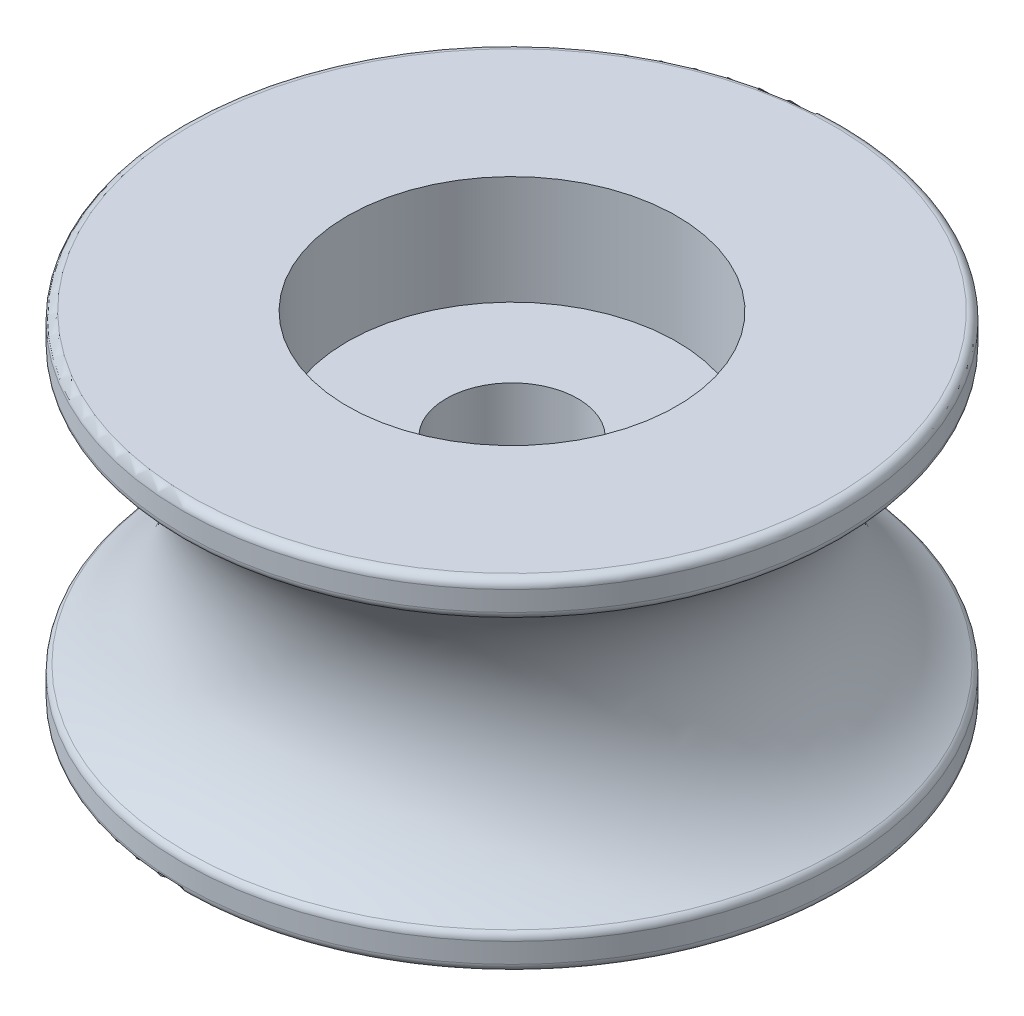
ISO-10303-21;
HEADER;
FILE_DESCRIPTION(('STEP AP214'),'2;1');
FILE_NAME('part.step','',(''),(''),'','','');
FILE_SCHEMA(('AUTOMOTIVE_DESIGN { 1 0 10303 214 1 1 1 1 }'));
ENDSEC;
DATA;
#1=APPLICATION_CONTEXT('core data for automotive mechanical design processes');
#2=APPLICATION_PROTOCOL_DEFINITION('international standard','automotive_design',2000,#1);
#3=PRODUCT_CONTEXT('',#1,'mechanical');
#4=PRODUCT('Part','Part','',(#3));
#5=PRODUCT_RELATED_PRODUCT_CATEGORY('part','',(#4));
#6=PRODUCT_DEFINITION_FORMATION('','',#4);
#7=PRODUCT_DEFINITION_CONTEXT('part definition',#1,'design');
#8=PRODUCT_DEFINITION('design','',#6,#7);
#9=PRODUCT_DEFINITION_SHAPE('','',#8);
#10=(LENGTH_UNIT() NAMED_UNIT(*) SI_UNIT(.MILLI.,.METRE.));
#11=(NAMED_UNIT(*) PLANE_ANGLE_UNIT() SI_UNIT($,.RADIAN.));
#12=(NAMED_UNIT(*) SI_UNIT($,.STERADIAN.) SOLID_ANGLE_UNIT());
#13=UNCERTAINTY_MEASURE_WITH_UNIT(LENGTH_MEASURE(1.E-05),#10,'distance_accuracy_value','');
#14=(GEOMETRIC_REPRESENTATION_CONTEXT(3) GLOBAL_UNCERTAINTY_ASSIGNED_CONTEXT((#13)) GLOBAL_UNIT_ASSIGNED_CONTEXT((#10,
#11,#12)) REPRESENTATION_CONTEXT('',''));
#15=CARTESIAN_POINT('',(0.,0.,0.));
#16=DIRECTION('',(0.,0.,1.));
#17=DIRECTION('',(1.,0.,0.));
#18=AXIS2_PLACEMENT_3D('',#15,#16,#17);
#19=CARTESIAN_POINT('',(9.99999999999999,10.35,0.));
#20=DIRECTION('',(0.,1.,0.));
#21=DIRECTION('',(-1.,0.,0.));
#22=AXIS2_PLACEMENT_3D('',#19,#20,#21);
#23=PLANE('',#22);
#24=CARTESIAN_POINT('',(0.,10.35,0.));
#25=DIRECTION('',(0.,1.,0.));
#26=DIRECTION('',(-1.,0.,0.));
#27=AXIS2_PLACEMENT_3D('',#24,#25,#26);
#28=CIRCLE('',#27,19.5);
#29=CARTESIAN_POINT('',(-19.5,10.35,0.));
#30=VERTEX_POINT('',#29);
#31=EDGE_CURVE('E43',#30,#30,#28,.T.);
#32=ORIENTED_EDGE('',*,*,#31,.T.);
#33=EDGE_LOOP('',(#32));
#34=FACE_BOUND('',#33,.T.);
#35=CARTESIAN_POINT('',(0.,10.35,0.));
#36=DIRECTION('',(0.,1.,0.));
#37=DIRECTION('',(-1.,0.,0.));
#38=AXIS2_PLACEMENT_3D('',#35,#36,#37);
#39=CIRCLE('',#38,9.99999999999999);
#40=CARTESIAN_POINT('',(-9.99999999999999,10.35,0.));
#41=VERTEX_POINT('',#40);
#42=EDGE_CURVE('E64',#41,#41,#39,.T.);
#43=ORIENTED_EDGE('',*,*,#42,.F.);
#44=EDGE_LOOP('',(#43));
#45=FACE_BOUND('',#44,.T.);
#46=ADVANCED_FACE('F32',(#34,#45),#23,.T.);
#47=CARTESIAN_POINT('',(0.,10.35,0.));
#48=DIRECTION('',(0.,1.,0.));
#49=DIRECTION('',(-1.,0.,0.));
#50=AXIS2_PLACEMENT_3D('',#47,#48,#49);
#51=CYLINDRICAL_SURFACE('',#50,10.);
#52=CARTESIAN_POINT('',(0.,3.75,0.));
#53=DIRECTION('',(0.,1.,0.));
#54=DIRECTION('',(-1.,0.,0.));
#55=AXIS2_PLACEMENT_3D('',#52,#53,#54);
#56=CIRCLE('',#55,10.);
#57=CARTESIAN_POINT('',(-10.,3.75,0.));
#58=VERTEX_POINT('',#57);
#59=EDGE_CURVE('E67',#58,#58,#56,.T.);
#60=ORIENTED_EDGE('',*,*,#59,.F.);
#61=EDGE_LOOP('',(#60));
#62=FACE_BOUND('',#61,.T.);
#63=ORIENTED_EDGE('',*,*,#42,.T.);
#64=EDGE_LOOP('',(#63));
#65=FACE_BOUND('',#64,.T.);
#66=ADVANCED_FACE('F101',(#62,#65),#51,.F.);
#67=CARTESIAN_POINT('',(10.,3.75,0.));
#68=DIRECTION('',(0.,-1.,0.));
#69=DIRECTION('',(1.,0.,0.));
#70=AXIS2_PLACEMENT_3D('',#67,#68,#69);
#71=PLANE('',#70);
#72=CARTESIAN_POINT('',(0.,3.75,0.));
#73=DIRECTION('',(0.,1.,0.));
#74=DIRECTION('',(-1.,0.,0.));
#75=AXIS2_PLACEMENT_3D('',#72,#73,#74);
#76=CIRCLE('',#75,4.);
#77=CARTESIAN_POINT('',(-4.,3.75,0.));
#78=VERTEX_POINT('',#77);
#79=EDGE_CURVE('E70',#78,#78,#76,.T.);
#80=ORIENTED_EDGE('',*,*,#79,.F.);
#81=EDGE_LOOP('',(#80));
#82=FACE_BOUND('',#81,.T.);
#83=ORIENTED_EDGE('',*,*,#59,.T.);
#84=EDGE_LOOP('',(#83));
#85=FACE_BOUND('',#84,.T.);
#86=ADVANCED_FACE('F107',(#82,#85),#71,.F.);
#87=CARTESIAN_POINT('',(0.,10.35,0.));
#88=DIRECTION('',(0.,1.,0.));
#89=DIRECTION('',(-1.,0.,0.));
#90=AXIS2_PLACEMENT_3D('',#87,#88,#89);
#91=CYLINDRICAL_SURFACE('',#90,4.);
#92=CARTESIAN_POINT('',(0.,-3.75,0.));
#93=DIRECTION('',(0.,1.,0.));
#94=DIRECTION('',(-1.,0.,0.));
#95=AXIS2_PLACEMENT_3D('',#92,#93,#94);
#96=CIRCLE('',#95,4.);
#97=CARTESIAN_POINT('',(-4.,-3.75,0.));
#98=VERTEX_POINT('',#97);
#99=EDGE_CURVE('E73',#98,#98,#96,.T.);
#100=ORIENTED_EDGE('',*,*,#99,.F.);
#101=EDGE_LOOP('',(#100));
#102=FACE_BOUND('',#101,.T.);
#103=ORIENTED_EDGE('',*,*,#79,.T.);
#104=EDGE_LOOP('',(#103));
#105=FACE_BOUND('',#104,.T.);
#106=ADVANCED_FACE('F97',(#102,#105),#91,.F.);
#107=CARTESIAN_POINT('',(10.,-3.75,0.));
#108=DIRECTION('',(0.,-1.,0.));
#109=DIRECTION('',(1.,0.,0.));
#110=AXIS2_PLACEMENT_3D('',#107,#108,#109);
#111=PLANE('',#110);
#112=ORIENTED_EDGE('',*,*,#99,.T.);
#113=EDGE_LOOP('',(#112));
#114=FACE_BOUND('',#113,.T.);
#115=CARTESIAN_POINT('',(0.,-3.75,0.));
#116=DIRECTION('',(0.,1.,0.));
#117=DIRECTION('',(-1.,0.,0.));
#118=AXIS2_PLACEMENT_3D('',#115,#116,#117);
#119=CIRCLE('',#118,10.);
#120=CARTESIAN_POINT('',(-10.,-3.75,0.));
#121=VERTEX_POINT('',#120);
#122=EDGE_CURVE('E76',#121,#121,#119,.T.);
#123=ORIENTED_EDGE('',*,*,#122,.F.);
#124=EDGE_LOOP('',(#123));
#125=FACE_BOUND('',#124,.T.);
#126=ADVANCED_FACE('F87',(#114,#125),#111,.T.);
#127=CARTESIAN_POINT('',(0.,10.35,0.));
#128=DIRECTION('',(0.,1.,0.));
#129=DIRECTION('',(-1.,0.,0.));
#130=AXIS2_PLACEMENT_3D('',#127,#128,#129);
#131=CYLINDRICAL_SURFACE('',#130,10.);
#132=ORIENTED_EDGE('',*,*,#122,.T.);
#133=EDGE_LOOP('',(#132));
#134=FACE_BOUND('',#133,.T.);
#135=CARTESIAN_POINT('',(0.,-10.35,0.));
#136=DIRECTION('',(0.,1.,0.));
#137=DIRECTION('',(-1.,0.,0.));
#138=AXIS2_PLACEMENT_3D('',#135,#136,#137);
#139=CIRCLE('',#138,10.);
#140=CARTESIAN_POINT('',(-10.,-10.35,0.));
#141=VERTEX_POINT('',#140);
#142=EDGE_CURVE('E79',#141,#141,#139,.T.);
#143=ORIENTED_EDGE('',*,*,#142,.F.);
#144=EDGE_LOOP('',(#143));
#145=FACE_BOUND('',#144,.T.);
#146=ADVANCED_FACE('F85',(#134,#145),#131,.F.);
#147=CARTESIAN_POINT('',(10.,-10.35,0.));
#148=DIRECTION('',(0.,1.,0.));
#149=DIRECTION('',(-1.,0.,0.));
#150=AXIS2_PLACEMENT_3D('',#147,#148,#149);
#151=PLANE('',#150);
#152=CARTESIAN_POINT('',(0.,-10.35,0.));
#153=DIRECTION('',(0.,1.,0.));
#154=DIRECTION('',(-1.,0.,0.));
#155=AXIS2_PLACEMENT_3D('',#152,#153,#154);
#156=CIRCLE('',#155,19.5);
#157=CARTESIAN_POINT('',(-19.5,-10.35,0.));
#158=VERTEX_POINT('',#157);
#159=EDGE_CURVE('E55',#158,#158,#156,.F.);
#160=ORIENTED_EDGE('',*,*,#159,.T.);
#161=EDGE_LOOP('',(#160));
#162=FACE_BOUND('',#161,.T.);
#163=ORIENTED_EDGE('',*,*,#142,.T.);
#164=EDGE_LOOP('',(#163));
#165=FACE_BOUND('',#164,.T.);
#166=ADVANCED_FACE('F83',(#162,#165),#151,.F.);
#167=CARTESIAN_POINT('',(0.,10.35,0.));
#168=DIRECTION('',(0.,1.,0.));
#169=DIRECTION('',(-1.,0.,0.));
#170=AXIS2_PLACEMENT_3D('',#167,#168,#169);
#171=CYLINDRICAL_SURFACE('',#170,20.);
#172=CARTESIAN_POINT('',(0.,-9.85,0.));
#173=DIRECTION('',(0.,1.,0.));
#174=DIRECTION('',(-1.,0.,0.));
#175=AXIS2_PLACEMENT_3D('',#172,#173,#174);
#176=CIRCLE('',#175,20.);
#177=CARTESIAN_POINT('',(-20.,-9.85,0.));
#178=VERTEX_POINT('',#177);
#179=EDGE_CURVE('E58',#178,#178,#176,.T.);
#180=ORIENTED_EDGE('',*,*,#179,.T.);
#181=EDGE_LOOP('',(#180));
#182=FACE_BOUND('',#181,.T.);
#183=CARTESIAN_POINT('',(0.,-8.64440421950303,0.));
#184=DIRECTION('',(0.,-1.,0.));
#185=DIRECTION('',(1.,0.,0.));
#186=AXIS2_PLACEMENT_3D('',#183,#184,#185);
#187=CIRCLE('',#186,20.);
#188=CARTESIAN_POINT('',(20.,-8.64440421950303,0.));
#189=VERTEX_POINT('',#188);
#190=EDGE_CURVE('E61',#189,#189,#187,.T.);
#191=ORIENTED_EDGE('',*,*,#190,.T.);
#192=EDGE_LOOP('',(#191));
#193=FACE_BOUND('',#192,.T.);
#194=ADVANCED_FACE('F94',(#182,#193),#171,.T.);
#195=CARTESIAN_POINT('',(0.,0.,0.));
#196=DIRECTION('',(0.,1.,0.));
#197=DIRECTION('',(-1.,0.,0.));
#198=AXIS2_PLACEMENT_3D('',#195,#196,#197);
#199=TOROIDAL_SURFACE('',#198,24.4661446031349,9.46936891329676);
#200=CARTESIAN_POINT('',(0.,-8.21085600322757,0.));
#201=DIRECTION('',(0.,1.,0.));
#202=DIRECTION('',(-1.,0.,0.));
#203=AXIS2_PLACEMENT_3D('',#200,#201,#202);
#204=CIRCLE('',#203,19.7490701591207);
#205=CARTESIAN_POINT('',(-19.7490701591207,-8.21085600322757,0.));
#206=VERTEX_POINT('',#205);
#207=EDGE_CURVE('E47',#206,#206,#204,.T.);
#208=ORIENTED_EDGE('',*,*,#207,.T.);
#209=EDGE_LOOP('',(#208));
#210=FACE_BOUND('',#209,.T.);
#211=CARTESIAN_POINT('',(0.,8.21085600322759,0.));
#212=DIRECTION('',(0.,-1.,0.));
#213=DIRECTION('',(1.,0.,0.));
#214=AXIS2_PLACEMENT_3D('',#211,#212,#213);
#215=CIRCLE('',#214,19.7490701591207);
#216=CARTESIAN_POINT('',(19.7490701591207,8.21085600322759,0.));
#217=VERTEX_POINT('',#216);
#218=EDGE_CURVE('E52',#217,#217,#215,.T.);
#219=ORIENTED_EDGE('',*,*,#218,.T.);
#220=EDGE_LOOP('',(#219));
#221=FACE_BOUND('',#220,.T.);
#222=ADVANCED_FACE('F135',(#210,#221),#199,.F.);
#223=CARTESIAN_POINT('',(0.,10.35,0.));
#224=DIRECTION('',(0.,1.,0.));
#225=DIRECTION('',(-1.,0.,0.));
#226=AXIS2_PLACEMENT_3D('',#223,#224,#225);
#227=CYLINDRICAL_SURFACE('',#226,20.);
#228=CARTESIAN_POINT('',(0.,9.85,0.));
#229=DIRECTION('',(0.,1.,0.));
#230=DIRECTION('',(-1.,0.,0.));
#231=AXIS2_PLACEMENT_3D('',#228,#229,#230);
#232=CIRCLE('',#231,20.);
#233=CARTESIAN_POINT('',(-20.,9.85,0.));
#234=VERTEX_POINT('',#233);
#235=EDGE_CURVE('E10',#234,#234,#232,.F.);
#236=ORIENTED_EDGE('',*,*,#235,.T.);
#237=EDGE_LOOP('',(#236));
#238=FACE_BOUND('',#237,.T.);
#239=CARTESIAN_POINT('',(0.,8.64440421950304,0.));
#240=DIRECTION('',(0.,-1.,0.));
#241=DIRECTION('',(1.,0.,0.));
#242=AXIS2_PLACEMENT_3D('',#239,#240,#241);
#243=CIRCLE('',#242,20.);
#244=CARTESIAN_POINT('',(20.,8.64440421950304,0.));
#245=VERTEX_POINT('',#244);
#246=EDGE_CURVE('E39',#245,#245,#243,.F.);
#247=ORIENTED_EDGE('',*,*,#246,.T.);
#248=EDGE_LOOP('',(#247));
#249=FACE_BOUND('',#248,.T.);
#250=ADVANCED_FACE('F117',(#238,#249),#227,.T.);
#251=CARTESIAN_POINT('',(0.,-9.85,0.));
#252=DIRECTION('',(0.,1.,0.));
#253=DIRECTION('',(-1.,0.,0.));
#254=AXIS2_PLACEMENT_3D('',#251,#252,#253);
#255=TOROIDAL_SURFACE('',#254,19.5,0.5);
#256=ORIENTED_EDGE('',*,*,#159,.F.);
#257=EDGE_LOOP('',(#256));
#258=FACE_BOUND('',#257,.T.);
#259=ORIENTED_EDGE('',*,*,#179,.F.);
#260=EDGE_LOOP('',(#259));
#261=FACE_BOUND('',#260,.T.);
#262=ADVANCED_FACE('F113',(#258,#261),#255,.T.);
#263=CARTESIAN_POINT('',(0.,-8.64440421950303,0.));
#264=DIRECTION('',(0.,-1.,0.));
#265=DIRECTION('',(1.,0.,0.));
#266=AXIS2_PLACEMENT_3D('',#263,#264,#265);
#267=TOROIDAL_SURFACE('',#266,19.5,0.5);
#268=ORIENTED_EDGE('',*,*,#190,.F.);
#269=EDGE_LOOP('',(#268));
#270=FACE_BOUND('',#269,.T.);
#271=ORIENTED_EDGE('',*,*,#207,.F.);
#272=EDGE_LOOP('',(#271));
#273=FACE_BOUND('',#272,.T.);
#274=ADVANCED_FACE('F116',(#270,#273),#267,.T.);
#275=CARTESIAN_POINT('',(0.,9.85,0.));
#276=DIRECTION('',(0.,1.,0.));
#277=DIRECTION('',(-1.,0.,0.));
#278=AXIS2_PLACEMENT_3D('',#275,#276,#277);
#279=TOROIDAL_SURFACE('',#278,19.5,0.5);
#280=ORIENTED_EDGE('',*,*,#235,.F.);
#281=EDGE_LOOP('',(#280));
#282=FACE_BOUND('',#281,.T.);
#283=ORIENTED_EDGE('',*,*,#31,.F.);
#284=EDGE_LOOP('',(#283));
#285=FACE_BOUND('',#284,.T.);
#286=ADVANCED_FACE('F120',(#282,#285),#279,.T.);
#287=CARTESIAN_POINT('',(0.,8.64440421950304,0.));
#288=DIRECTION('',(0.,-1.,0.));
#289=DIRECTION('',(1.,0.,0.));
#290=AXIS2_PLACEMENT_3D('',#287,#288,#289);
#291=TOROIDAL_SURFACE('',#290,19.5,0.5);
#292=ORIENTED_EDGE('',*,*,#218,.F.);
#293=EDGE_LOOP('',(#292));
#294=FACE_BOUND('',#293,.T.);
#295=ORIENTED_EDGE('',*,*,#246,.F.);
#296=EDGE_LOOP('',(#295));
#297=FACE_BOUND('',#296,.T.);
#298=ADVANCED_FACE('F34',(#294,#297),#291,.T.);
#299=CLOSED_SHELL('',(#46,#66,#86,#106,#126,#146,#166,#194,#222,#250,#262,#274,#286,#298));
#300=MANIFOLD_SOLID_BREP('B2',#299);
#301=ADVANCED_BREP_SHAPE_REPRESENTATION('',(#18,#300),#14);
#302=SHAPE_DEFINITION_REPRESENTATION(#9,#301);
ENDSEC;
END-ISO-10303-21;
